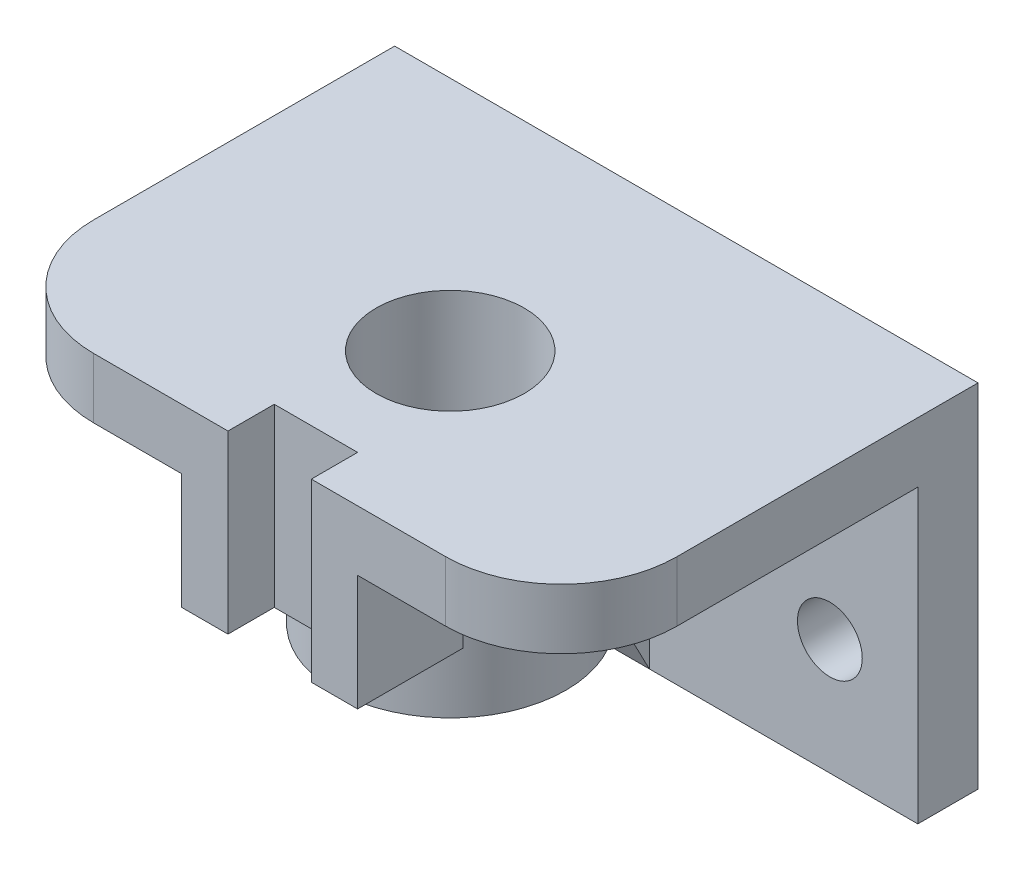
ISO-10303-21;
HEADER;
FILE_DESCRIPTION(('STEP AP214'),'2;1');
FILE_NAME('part.step','',(''),(''),'','','');
FILE_SCHEMA(('AUTOMOTIVE_DESIGN { 1 0 10303 214 1 1 1 1 }'));
ENDSEC;
DATA;
#1=APPLICATION_CONTEXT('core data for automotive mechanical design processes');
#2=APPLICATION_PROTOCOL_DEFINITION('international standard','automotive_design',2000,#1);
#3=PRODUCT_CONTEXT('',#1,'mechanical');
#4=PRODUCT('Part','Part','',(#3));
#5=PRODUCT_RELATED_PRODUCT_CATEGORY('part','',(#4));
#6=PRODUCT_DEFINITION_FORMATION('','',#4);
#7=PRODUCT_DEFINITION_CONTEXT('part definition',#1,'design');
#8=PRODUCT_DEFINITION('design','',#6,#7);
#9=PRODUCT_DEFINITION_SHAPE('','',#8);
#10=(LENGTH_UNIT() NAMED_UNIT(*) SI_UNIT(.MILLI.,.METRE.));
#11=(NAMED_UNIT(*) PLANE_ANGLE_UNIT() SI_UNIT($,.RADIAN.));
#12=(NAMED_UNIT(*) SI_UNIT($,.STERADIAN.) SOLID_ANGLE_UNIT());
#13=UNCERTAINTY_MEASURE_WITH_UNIT(LENGTH_MEASURE(1.E-05),#10,'distance_accuracy_value','');
#14=(GEOMETRIC_REPRESENTATION_CONTEXT(3) GLOBAL_UNCERTAINTY_ASSIGNED_CONTEXT((#13)) GLOBAL_UNIT_ASSIGNED_CONTEXT((#10,
#11,#12)) REPRESENTATION_CONTEXT('',''));
#15=CARTESIAN_POINT('',(0.,0.,0.));
#16=DIRECTION('',(0.,0.,1.));
#17=DIRECTION('',(1.,0.,0.));
#18=AXIS2_PLACEMENT_3D('',#15,#16,#17);
#19=CARTESIAN_POINT('',(0.,63.,90.));
#20=DIRECTION('',(0.,1.,0.));
#21=DIRECTION('',(0.,0.,1.));
#22=AXIS2_PLACEMENT_3D('',#19,#20,#21);
#23=PLANE('',#22);
#24=DIRECTION('',(1.,0.,0.));
#25=VECTOR('',#24,1.);
#26=CARTESIAN_POINT('',(0.,63.,13.));
#27=LINE('',#26,#25);
#28=CARTESIAN_POINT('',(0.,63.,13.));
#29=VERTEX_POINT('',#28);
#30=CARTESIAN_POINT('',(58.,63.,13.));
#31=VERTEX_POINT('',#30);
#32=EDGE_CURVE('E366',#29,#31,#27,.T.);
#33=ORIENTED_EDGE('',*,*,#32,.T.);
#34=DIRECTION('',(0.,0.,1.));
#35=VECTOR('',#34,1.);
#36=CARTESIAN_POINT('',(58.,63.,90.));
#37=LINE('',#36,#35);
#38=CARTESIAN_POINT('',(58.,63.,26.5051025721682));
#39=VERTEX_POINT('',#38);
#40=EDGE_CURVE('E313',#31,#39,#37,.T.);
#41=ORIENTED_EDGE('',*,*,#40,.T.);
#42=CARTESIAN_POINT('',(63.,63.,51.));
#43=DIRECTION('',(0.,1.,0.));
#44=DIRECTION('',(0.,0.,1.));
#45=AXIS2_PLACEMENT_3D('',#42,#43,#44);
#46=CIRCLE('',#45,25.);
#47=CARTESIAN_POINT('',(44.,63.,67.2480768092719));
#48=VERTEX_POINT('',#47);
#49=EDGE_CURVE('E359',#48,#39,#46,.F.);
#50=ORIENTED_EDGE('',*,*,#49,.F.);
#51=DIRECTION('',(0.,0.,1.));
#52=VECTOR('',#51,1.);
#53=CARTESIAN_POINT('',(44.,63.,-0.001000000000001));
#54=LINE('',#53,#52);
#55=CARTESIAN_POINT('',(44.,63.,90.));
#56=VERTEX_POINT('',#55);
#57=EDGE_CURVE('E340',#48,#56,#54,.T.);
#58=ORIENTED_EDGE('',*,*,#57,.T.);
#59=DIRECTION('',(1.,0.,0.));
#60=VECTOR('',#59,1.);
#61=CARTESIAN_POINT('',(0.,63.,90.));
#62=LINE('',#61,#60);
#63=CARTESIAN_POINT('',(25.,63.,90.));
#64=VERTEX_POINT('',#63);
#65=EDGE_CURVE('E370',#64,#56,#62,.T.);
#66=ORIENTED_EDGE('',*,*,#65,.F.);
#67=CARTESIAN_POINT('',(25.,63.,65.));
#68=DIRECTION('',(0.,1.,0.));
#69=DIRECTION('',(0.,0.,1.));
#70=AXIS2_PLACEMENT_3D('',#67,#68,#69);
#71=CIRCLE('',#70,25.);
#72=CARTESIAN_POINT('',(0.,63.,65.));
#73=VERTEX_POINT('',#72);
#74=EDGE_CURVE('E407',#64,#73,#71,.F.);
#75=ORIENTED_EDGE('',*,*,#74,.T.);
#76=DIRECTION('',(0.,0.,-1.));
#77=VECTOR('',#76,1.);
#78=CARTESIAN_POINT('',(0.,63.,90.));
#79=LINE('',#78,#77);
#80=EDGE_CURVE('E374',#73,#29,#79,.T.);
#81=ORIENTED_EDGE('',*,*,#80,.T.);
#82=EDGE_LOOP('',(#33,#41,#50,#58,#66,#75,#81));
#83=FACE_BOUND('',#82,.T.);
#84=ADVANCED_FACE('F41',(#83),#23,.F.);
#85=CARTESIAN_POINT('',(0.,0.,13.));
#86=DIRECTION('',(0.,0.,-1.));
#87=DIRECTION('',(-1.,0.,0.));
#88=AXIS2_PLACEMENT_3D('',#85,#86,#87);
#89=PLANE('',#88);
#90=CARTESIAN_POINT('',(19.,25.,13.));
#91=DIRECTION('',(0.,0.,1.));
#92=DIRECTION('',(1.,0.,0.));
#93=AXIS2_PLACEMENT_3D('',#90,#91,#92);
#94=CIRCLE('',#93,7.);
#95=CARTESIAN_POINT('',(26.,25.,13.));
#96=VERTEX_POINT('',#95);
#97=EDGE_CURVE('E742',#96,#96,#94,.T.);
#98=ORIENTED_EDGE('',*,*,#97,.F.);
#99=EDGE_LOOP('',(#98));
#100=FACE_BOUND('',#99,.T.);
#101=DIRECTION('',(0.,-1.,0.));
#102=VECTOR('',#101,1.);
#103=CARTESIAN_POINT('',(58.,0.,13.));
#104=LINE('',#103,#102);
#105=CARTESIAN_POINT('',(58.,0.,13.));
#106=VERTEX_POINT('',#105);
#107=EDGE_CURVE('E195',#31,#106,#104,.T.);
#108=ORIENTED_EDGE('',*,*,#107,.F.);
#109=ORIENTED_EDGE('',*,*,#32,.F.);
#110=DIRECTION('',(0.,1.,0.));
#111=VECTOR('',#110,1.);
#112=CARTESIAN_POINT('',(0.,0.,13.));
#113=LINE('',#112,#111);
#114=CARTESIAN_POINT('',(0.,0.,13.));
#115=VERTEX_POINT('',#114);
#116=EDGE_CURVE('E381',#115,#29,#113,.T.);
#117=ORIENTED_EDGE('',*,*,#116,.F.);
#118=DIRECTION('',(1.,0.,0.));
#119=VECTOR('',#118,1.);
#120=CARTESIAN_POINT('',(0.,0.,13.));
#121=LINE('',#120,#119);
#122=EDGE_CURVE('E385',#115,#106,#121,.T.);
#123=ORIENTED_EDGE('',*,*,#122,.T.);
#124=EDGE_LOOP('',(#108,#109,#117,#123));
#125=FACE_BOUND('',#124,.T.);
#126=ADVANCED_FACE('F487',(#100,#125),#89,.F.);
#127=CARTESIAN_POINT('',(0.,0.,13.));
#128=DIRECTION('',(-1.,0.,0.));
#129=DIRECTION('',(0.,0.,1.));
#130=AXIS2_PLACEMENT_3D('',#127,#128,#129);
#131=PLANE('',#130);
#132=ORIENTED_EDGE('',*,*,#80,.F.);
#133=DIRECTION('',(0.,-1.,0.));
#134=VECTOR('',#133,1.);
#135=CARTESIAN_POINT('',(0.,0.,65.));
#136=LINE('',#135,#134);
#137=CARTESIAN_POINT('',(0.,76.,65.));
#138=VERTEX_POINT('',#137);
#139=EDGE_CURVE('E410',#73,#138,#136,.F.);
#140=ORIENTED_EDGE('',*,*,#139,.T.);
#141=DIRECTION('',(0.,0.,-1.));
#142=VECTOR('',#141,1.);
#143=CARTESIAN_POINT('',(0.,76.,13.));
#144=LINE('',#143,#142);
#145=CARTESIAN_POINT('',(0.,76.,0.));
#146=VERTEX_POINT('',#145);
#147=EDGE_CURVE('E389',#138,#146,#144,.T.);
#148=ORIENTED_EDGE('',*,*,#147,.T.);
#149=DIRECTION('',(0.,1.,0.));
#150=VECTOR('',#149,1.);
#151=CARTESIAN_POINT('',(0.,0.,0.));
#152=LINE('',#151,#150);
#153=CARTESIAN_POINT('',(0.,0.,0.));
#154=VERTEX_POINT('',#153);
#155=EDGE_CURVE('E380',#154,#146,#152,.T.);
#156=ORIENTED_EDGE('',*,*,#155,.F.);
#157=DIRECTION('',(0.,0.,-1.));
#158=VECTOR('',#157,1.);
#159=CARTESIAN_POINT('',(0.,0.,13.));
#160=LINE('',#159,#158);
#161=EDGE_CURVE('E398',#115,#154,#160,.T.);
#162=ORIENTED_EDGE('',*,*,#161,.F.);
#163=ORIENTED_EDGE('',*,*,#116,.T.);
#164=EDGE_LOOP('',(#132,#140,#148,#156,#162,#163));
#165=FACE_BOUND('',#164,.T.);
#166=ADVANCED_FACE('F475',(#165),#131,.T.);
#167=CARTESIAN_POINT('',(0.,0.,13.));
#168=DIRECTION('',(0.,1.,0.));
#169=DIRECTION('',(0.,0.,1.));
#170=AXIS2_PLACEMENT_3D('',#167,#168,#169);
#171=PLANE('',#170);
#172=DIRECTION('',(1.,0.,0.));
#173=VECTOR('',#172,1.);
#174=CARTESIAN_POINT('',(0.,0.,13.));
#175=LINE('',#174,#173);
#176=CARTESIAN_POINT('',(68.,0.,13.));
#177=VERTEX_POINT('',#176);
#178=EDGE_CURVE('E182',#106,#177,#175,.T.);
#179=ORIENTED_EDGE('',*,*,#178,.F.);
#180=ORIENTED_EDGE('',*,*,#122,.F.);
#181=ORIENTED_EDGE('',*,*,#161,.T.);
#182=DIRECTION('',(1.,0.,0.));
#183=VECTOR('',#182,1.);
#184=CARTESIAN_POINT('',(0.,0.,0.));
#185=LINE('',#184,#183);
#186=CARTESIAN_POINT('',(126.,0.,0.));
#187=VERTEX_POINT('',#186);
#188=EDGE_CURVE('E386',#154,#187,#185,.T.);
#189=ORIENTED_EDGE('',*,*,#188,.T.);
#190=DIRECTION('',(0.,0.,-1.));
#191=VECTOR('',#190,1.);
#192=CARTESIAN_POINT('',(126.,0.,13.));
#193=LINE('',#192,#191);
#194=CARTESIAN_POINT('',(126.,0.,13.));
#195=VERTEX_POINT('',#194);
#196=EDGE_CURVE('E213',#195,#187,#193,.T.);
#197=ORIENTED_EDGE('',*,*,#196,.F.);
#198=DIRECTION('',(-1.,0.,0.));
#199=VECTOR('',#198,1.);
#200=CARTESIAN_POINT('',(126.,0.,13.));
#201=LINE('',#200,#199);
#202=EDGE_CURVE('E210',#195,#177,#201,.T.);
#203=ORIENTED_EDGE('',*,*,#202,.T.);
#204=EDGE_LOOP('',(#179,#180,#181,#189,#197,#203));
#205=FACE_BOUND('',#204,.T.);
#206=ADVANCED_FACE('F211',(#205),#171,.F.);
#207=CARTESIAN_POINT('',(0.,76.,13.));
#208=DIRECTION('',(0.,1.,0.));
#209=DIRECTION('',(0.,0.,1.));
#210=AXIS2_PLACEMENT_3D('',#207,#208,#209);
#211=PLANE('',#210);
#212=CARTESIAN_POINT('',(63.,76.,51.));
#213=DIRECTION('',(0.,1.,0.));
#214=DIRECTION('',(0.,0.,1.));
#215=AXIS2_PLACEMENT_3D('',#212,#213,#214);
#216=CIRCLE('',#215,16.);
#217=CARTESIAN_POINT('',(63.,76.,67.));
#218=VERTEX_POINT('',#217);
#219=EDGE_CURVE('E746',#218,#218,#216,.T.);
#220=ORIENTED_EDGE('',*,*,#219,.F.);
#221=EDGE_LOOP('',(#220));
#222=FACE_BOUND('',#221,.T.);
#223=DIRECTION('',(-1.,0.,0.));
#224=VECTOR('',#223,1.);
#225=CARTESIAN_POINT('',(0.,76.,80.));
#226=LINE('',#225,#224);
#227=CARTESIAN_POINT('',(72.,76.,80.));
#228=VERTEX_POINT('',#227);
#229=CARTESIAN_POINT('',(54.,76.,80.));
#230=VERTEX_POINT('',#229);
#231=EDGE_CURVE('E11',#228,#230,#226,.T.);
#232=ORIENTED_EDGE('',*,*,#231,.F.);
#233=DIRECTION('',(0.,0.,1.));
#234=VECTOR('',#233,1.);
#235=CARTESIAN_POINT('',(72.,76.,13.));
#236=LINE('',#235,#234);
#237=CARTESIAN_POINT('',(72.,76.,90.));
#238=VERTEX_POINT('',#237);
#239=EDGE_CURVE('E257',#228,#238,#236,.T.);
#240=ORIENTED_EDGE('',*,*,#239,.T.);
#241=DIRECTION('',(1.,0.,0.));
#242=VECTOR('',#241,1.);
#243=CARTESIAN_POINT('',(63.,76.,90.));
#244=LINE('',#243,#242);
#245=CARTESIAN_POINT('',(101.,76.,90.));
#246=VERTEX_POINT('',#245);
#247=EDGE_CURVE('E265',#238,#246,#244,.T.);
#248=ORIENTED_EDGE('',*,*,#247,.T.);
#249=CARTESIAN_POINT('',(101.,76.,65.));
#250=DIRECTION('',(0.,-1.,0.));
#251=DIRECTION('',(0.,0.,1.));
#252=AXIS2_PLACEMENT_3D('',#249,#250,#251);
#253=CIRCLE('',#252,25.);
#254=CARTESIAN_POINT('',(126.,76.,65.));
#255=VERTEX_POINT('',#254);
#256=EDGE_CURVE('E301',#255,#246,#253,.T.);
#257=ORIENTED_EDGE('',*,*,#256,.F.);
#258=DIRECTION('',(0.,0.,-1.));
#259=VECTOR('',#258,1.);
#260=CARTESIAN_POINT('',(126.,76.,13.));
#261=LINE('',#260,#259);
#262=CARTESIAN_POINT('',(126.,76.,0.));
#263=VERTEX_POINT('',#262);
#264=EDGE_CURVE('E217',#255,#263,#261,.T.);
#265=ORIENTED_EDGE('',*,*,#264,.T.);
#266=DIRECTION('',(1.,0.,0.));
#267=VECTOR('',#266,1.);
#268=CARTESIAN_POINT('',(0.,76.,0.));
#269=LINE('',#268,#267);
#270=EDGE_CURVE('E393',#146,#263,#269,.T.);
#271=ORIENTED_EDGE('',*,*,#270,.F.);
#272=ORIENTED_EDGE('',*,*,#147,.F.);
#273=CARTESIAN_POINT('',(25.,76.,65.));
#274=DIRECTION('',(0.,1.,0.));
#275=DIRECTION('',(0.,0.,1.));
#276=AXIS2_PLACEMENT_3D('',#273,#274,#275);
#277=CIRCLE('',#276,25.);
#278=CARTESIAN_POINT('',(25.,76.,90.));
#279=VERTEX_POINT('',#278);
#280=EDGE_CURVE('E413',#138,#279,#277,.T.);
#281=ORIENTED_EDGE('',*,*,#280,.T.);
#282=DIRECTION('',(-1.,0.,0.));
#283=VECTOR('',#282,1.);
#284=CARTESIAN_POINT('',(63.,76.,90.));
#285=LINE('',#284,#283);
#286=CARTESIAN_POINT('',(54.,76.,90.));
#287=VERTEX_POINT('',#286);
#288=EDGE_CURVE('E367',#287,#279,#285,.T.);
#289=ORIENTED_EDGE('',*,*,#288,.F.);
#290=DIRECTION('',(0.,0.,1.));
#291=VECTOR('',#290,1.);
#292=CARTESIAN_POINT('',(54.,76.,13.));
#293=LINE('',#292,#291);
#294=EDGE_CURVE('E351',#230,#287,#293,.T.);
#295=ORIENTED_EDGE('',*,*,#294,.F.);
#296=EDGE_LOOP('',(#232,#240,#248,#257,#265,#271,#272,#281,#289,#295));
#297=FACE_BOUND('',#296,.T.);
#298=ADVANCED_FACE('F438',(#222,#297),#211,.T.);
#299=CARTESIAN_POINT('',(0.,0.,0.));
#300=DIRECTION('',(0.,0.,-1.));
#301=DIRECTION('',(-1.,0.,0.));
#302=AXIS2_PLACEMENT_3D('',#299,#300,#301);
#303=PLANE('',#302);
#304=CARTESIAN_POINT('',(107.,25.,0.));
#305=DIRECTION('',(0.,0.,1.));
#306=DIRECTION('',(1.,0.,0.));
#307=AXIS2_PLACEMENT_3D('',#304,#305,#306);
#308=CIRCLE('',#307,7.);
#309=CARTESIAN_POINT('',(114.,25.,0.));
#310=VERTEX_POINT('',#309);
#311=EDGE_CURVE('E753',#310,#310,#308,.T.);
#312=ORIENTED_EDGE('',*,*,#311,.T.);
#313=EDGE_LOOP('',(#312));
#314=FACE_BOUND('',#313,.T.);
#315=CARTESIAN_POINT('',(19.,25.,0.));
#316=DIRECTION('',(0.,0.,1.));
#317=DIRECTION('',(1.,0.,0.));
#318=AXIS2_PLACEMENT_3D('',#315,#316,#317);
#319=CIRCLE('',#318,7.);
#320=CARTESIAN_POINT('',(26.,25.,0.));
#321=VERTEX_POINT('',#320);
#322=EDGE_CURVE('E207',#321,#321,#319,.T.);
#323=ORIENTED_EDGE('',*,*,#322,.T.);
#324=EDGE_LOOP('',(#323));
#325=FACE_BOUND('',#324,.T.);
#326=ORIENTED_EDGE('',*,*,#270,.T.);
#327=DIRECTION('',(0.,1.,0.));
#328=VECTOR('',#327,1.);
#329=CARTESIAN_POINT('',(126.,0.,0.));
#330=LINE('',#329,#328);
#331=EDGE_CURVE('E279',#187,#263,#330,.T.);
#332=ORIENTED_EDGE('',*,*,#331,.F.);
#333=ORIENTED_EDGE('',*,*,#188,.F.);
#334=ORIENTED_EDGE('',*,*,#155,.T.);
#335=EDGE_LOOP('',(#326,#332,#333,#334));
#336=FACE_BOUND('',#335,.T.);
#337=ADVANCED_FACE('F472',(#314,#325,#336),#303,.T.);
#338=CARTESIAN_POINT('',(0.,0.,90.));
#339=DIRECTION('',(0.,0.,1.));
#340=DIRECTION('',(1.,0.,0.));
#341=AXIS2_PLACEMENT_3D('',#338,#339,#340);
#342=PLANE('',#341);
#343=DIRECTION('',(0.,-1.,0.));
#344=VECTOR('',#343,1.);
#345=CARTESIAN_POINT('',(54.,0.,90.));
#346=LINE('',#345,#344);
#347=CARTESIAN_POINT('',(54.,38.,90.));
#348=VERTEX_POINT('',#347);
#349=EDGE_CURVE('E50',#287,#348,#346,.T.);
#350=ORIENTED_EDGE('',*,*,#349,.F.);
#351=ORIENTED_EDGE('',*,*,#288,.T.);
#352=DIRECTION('',(0.,-1.,0.));
#353=VECTOR('',#352,1.);
#354=CARTESIAN_POINT('',(25.,0.,90.));
#355=LINE('',#354,#353);
#356=EDGE_CURVE('E401',#279,#64,#355,.T.);
#357=ORIENTED_EDGE('',*,*,#356,.T.);
#358=ORIENTED_EDGE('',*,*,#65,.T.);
#359=DIRECTION('',(0.,-1.,0.));
#360=VECTOR('',#359,1.);
#361=CARTESIAN_POINT('',(44.,63.,90.));
#362=LINE('',#361,#360);
#363=CARTESIAN_POINT('',(44.,38.,90.));
#364=VERTEX_POINT('',#363);
#365=EDGE_CURVE('E323',#56,#364,#362,.T.);
#366=ORIENTED_EDGE('',*,*,#365,.T.);
#367=DIRECTION('',(1.,0.,0.));
#368=VECTOR('',#367,1.);
#369=CARTESIAN_POINT('',(44.,38.,90.));
#370=LINE('',#369,#368);
#371=EDGE_CURVE('E336',#364,#348,#370,.T.);
#372=ORIENTED_EDGE('',*,*,#371,.T.);
#373=EDGE_LOOP('',(#350,#351,#357,#358,#366,#372));
#374=FACE_BOUND('',#373,.T.);
#375=ADVANCED_FACE('F426',(#374),#342,.T.);
#376=CARTESIAN_POINT('',(25.,0.,65.));
#377=DIRECTION('',(0.,-1.,0.));
#378=DIRECTION('',(0.,0.,-1.));
#379=AXIS2_PLACEMENT_3D('',#376,#377,#378);
#380=CYLINDRICAL_SURFACE('',#379,25.);
#381=ORIENTED_EDGE('',*,*,#280,.F.);
#382=ORIENTED_EDGE('',*,*,#139,.F.);
#383=ORIENTED_EDGE('',*,*,#74,.F.);
#384=ORIENTED_EDGE('',*,*,#356,.F.);
#385=EDGE_LOOP('',(#381,#382,#383,#384));
#386=FACE_BOUND('',#385,.T.);
#387=ADVANCED_FACE('F43',(#386),#380,.T.);
#388=CARTESIAN_POINT('',(63.,25.,51.));
#389=DIRECTION('',(0.,-1.,0.));
#390=DIRECTION('',(0.,0.,-1.));
#391=AXIS2_PLACEMENT_3D('',#388,#389,#390);
#392=PLANE('',#391);
#393=CARTESIAN_POINT('',(63.,25.,51.));
#394=DIRECTION('',(0.,1.,0.));
#395=DIRECTION('',(0.,0.,-1.));
#396=AXIS2_PLACEMENT_3D('',#393,#394,#395);
#397=CIRCLE('',#396,16.);
#398=CARTESIAN_POINT('',(63.,25.,35.));
#399=VERTEX_POINT('',#398);
#400=EDGE_CURVE('E354',#399,#399,#397,.T.);
#401=ORIENTED_EDGE('',*,*,#400,.T.);
#402=EDGE_LOOP('',(#401));
#403=FACE_BOUND('',#402,.T.);
#404=CARTESIAN_POINT('',(63.,25.,51.));
#405=DIRECTION('',(0.,-1.,0.));
#406=DIRECTION('',(0.,0.,-1.));
#407=AXIS2_PLACEMENT_3D('',#404,#405,#406);
#408=CIRCLE('',#407,25.);
#409=CARTESIAN_POINT('',(63.,25.,26.));
#410=VERTEX_POINT('',#409);
#411=EDGE_CURVE('E355',#410,#410,#408,.T.);
#412=ORIENTED_EDGE('',*,*,#411,.T.);
#413=EDGE_LOOP('',(#412));
#414=FACE_BOUND('',#413,.T.);
#415=ADVANCED_FACE('F478',(#403,#414),#392,.T.);
#416=CARTESIAN_POINT('',(63.,118.901699437495,51.));
#417=DIRECTION('',(0.,-1.,0.));
#418=DIRECTION('',(0.,0.,-1.));
#419=AXIS2_PLACEMENT_3D('',#416,#417,#418);
#420=CYLINDRICAL_SURFACE('',#419,25.);
#421=CARTESIAN_POINT('',(63.,73.0769230769231,51.));
#422=DIRECTION('',(0.,-0.461352736641989,0.887216801234595));
#423=DIRECTION('',(0.,-0.887216801234595,-0.461352736641989));
#424=AXIS2_PLACEMENT_3D('',#421,#422,#423);
#425=ELLIPSE('',#424,54.1884723215591,25.);
#426=CARTESIAN_POINT('',(58.,25.9713511003235,26.5051025721682));
#427=VERTEX_POINT('',#426);
#428=EDGE_CURVE('E196',#410,#427,#425,.F.);
#429=ORIENTED_EDGE('',*,*,#428,.F.);
#430=ORIENTED_EDGE('',*,*,#411,.F.);
#431=CARTESIAN_POINT('',(63.,73.0769230769231,51.));
#432=DIRECTION('',(0.,0.461352736641989,-0.887216801234595));
#433=DIRECTION('',(0.,-0.887216801234595,-0.461352736641989));
#434=AXIS2_PLACEMENT_3D('',#431,#432,#433);
#435=ELLIPSE('',#434,54.1884723215591,25.);
#436=CARTESIAN_POINT('',(68.,25.9713511003235,26.5051025721682));
#437=VERTEX_POINT('',#436);
#438=EDGE_CURVE('E226',#410,#437,#435,.F.);
#439=ORIENTED_EDGE('',*,*,#438,.T.);
#440=DIRECTION('',(0.,-1.,0.));
#441=VECTOR('',#440,1.);
#442=CARTESIAN_POINT('',(68.,118.901699437495,26.5051025721682));
#443=LINE('',#442,#441);
#444=CARTESIAN_POINT('',(68.,63.,26.5051025721682));
#445=VERTEX_POINT('',#444);
#446=EDGE_CURVE('E204',#437,#445,#443,.F.);
#447=ORIENTED_EDGE('',*,*,#446,.T.);
#448=CARTESIAN_POINT('',(63.,63.,51.));
#449=DIRECTION('',(0.,-1.,0.));
#450=DIRECTION('',(0.,0.,1.));
#451=AXIS2_PLACEMENT_3D('',#448,#449,#450);
#452=CIRCLE('',#451,25.);
#453=CARTESIAN_POINT('',(82.,63.,67.2480768092719));
#454=VERTEX_POINT('',#453);
#455=EDGE_CURVE('E261',#454,#445,#452,.F.);
#456=ORIENTED_EDGE('',*,*,#455,.F.);
#457=DIRECTION('',(0.,-1.,0.));
#458=VECTOR('',#457,1.);
#459=CARTESIAN_POINT('',(82.,118.901699437495,67.248076809272));
#460=LINE('',#459,#458);
#461=CARTESIAN_POINT('',(82.,38.,67.248076809272));
#462=VERTEX_POINT('',#461);
#463=EDGE_CURVE('E237',#462,#454,#460,.F.);
#464=ORIENTED_EDGE('',*,*,#463,.F.);
#465=CARTESIAN_POINT('',(63.,38.,51.));
#466=DIRECTION('',(0.,-1.,0.));
#467=DIRECTION('',(0.,0.,-1.));
#468=AXIS2_PLACEMENT_3D('',#465,#466,#467);
#469=CIRCLE('',#468,25.);
#470=CARTESIAN_POINT('',(44.,38.,67.248076809272));
#471=VERTEX_POINT('',#470);
#472=EDGE_CURVE('E328',#462,#471,#469,.T.);
#473=ORIENTED_EDGE('',*,*,#472,.T.);
#474=DIRECTION('',(0.,-1.,0.));
#475=VECTOR('',#474,1.);
#476=CARTESIAN_POINT('',(44.,118.901699437495,67.248076809272));
#477=LINE('',#476,#475);
#478=EDGE_CURVE('E324',#471,#48,#477,.F.);
#479=ORIENTED_EDGE('',*,*,#478,.T.);
#480=ORIENTED_EDGE('',*,*,#49,.T.);
#481=DIRECTION('',(0.,-1.,0.));
#482=VECTOR('',#481,1.);
#483=CARTESIAN_POINT('',(58.,118.901699437495,26.5051025721682));
#484=LINE('',#483,#482);
#485=EDGE_CURVE('E57',#427,#39,#484,.F.);
#486=ORIENTED_EDGE('',*,*,#485,.F.);
#487=EDGE_LOOP('',(#429,#430,#439,#447,#456,#464,#473,#479,#480,#486));
#488=FACE_BOUND('',#487,.T.);
#489=ADVANCED_FACE('F451',(#488),#420,.T.);
#490=CARTESIAN_POINT('',(63.,118.901699437495,51.));
#491=DIRECTION('',(0.,-1.,0.));
#492=DIRECTION('',(0.,0.,-1.));
#493=AXIS2_PLACEMENT_3D('',#490,#491,#492);
#494=CYLINDRICAL_SURFACE('',#493,16.);
#495=ORIENTED_EDGE('',*,*,#400,.F.);
#496=EDGE_LOOP('',(#495));
#497=FACE_BOUND('',#496,.T.);
#498=ORIENTED_EDGE('',*,*,#219,.T.);
#499=EDGE_LOOP('',(#498));
#500=FACE_BOUND('',#499,.T.);
#501=ADVANCED_FACE('F553',(#497,#500),#494,.F.);
#502=CARTESIAN_POINT('',(54.,140.,80.));
#503=DIRECTION('',(0.,0.,-1.));
#504=DIRECTION('',(-1.,0.,0.));
#505=AXIS2_PLACEMENT_3D('',#502,#503,#504);
#506=PLANE('',#505);
#507=ORIENTED_EDGE('',*,*,#231,.T.);
#508=DIRECTION('',(0.,-1.,0.));
#509=VECTOR('',#508,1.);
#510=CARTESIAN_POINT('',(54.,140.,80.));
#511=LINE('',#510,#509);
#512=CARTESIAN_POINT('',(54.,38.,80.));
#513=VERTEX_POINT('',#512);
#514=EDGE_CURVE('E64',#230,#513,#511,.T.);
#515=ORIENTED_EDGE('',*,*,#514,.T.);
#516=DIRECTION('',(1.,0.,0.));
#517=VECTOR('',#516,1.);
#518=CARTESIAN_POINT('',(54.,38.,80.));
#519=LINE('',#518,#517);
#520=CARTESIAN_POINT('',(72.,38.,80.));
#521=VERTEX_POINT('',#520);
#522=EDGE_CURVE('E320',#513,#521,#519,.T.);
#523=ORIENTED_EDGE('',*,*,#522,.T.);
#524=DIRECTION('',(0.,-1.,0.));
#525=VECTOR('',#524,1.);
#526=CARTESIAN_POINT('',(72.,140.,80.));
#527=LINE('',#526,#525);
#528=EDGE_CURVE('E239',#228,#521,#527,.T.);
#529=ORIENTED_EDGE('',*,*,#528,.F.);
#530=EDGE_LOOP('',(#507,#515,#523,#529));
#531=FACE_BOUND('',#530,.T.);
#532=ADVANCED_FACE('F432',(#531),#506,.F.);
#533=CARTESIAN_POINT('',(54.,140.,90.));
#534=DIRECTION('',(-1.,0.,0.));
#535=DIRECTION('',(0.,0.,1.));
#536=AXIS2_PLACEMENT_3D('',#533,#534,#535);
#537=PLANE('',#536);
#538=DIRECTION('',(0.,0.,1.));
#539=VECTOR('',#538,1.);
#540=CARTESIAN_POINT('',(54.,38.,-0.001000000000001));
#541=LINE('',#540,#539);
#542=EDGE_CURVE('E329',#513,#348,#541,.T.);
#543=ORIENTED_EDGE('',*,*,#542,.F.);
#544=ORIENTED_EDGE('',*,*,#514,.F.);
#545=ORIENTED_EDGE('',*,*,#294,.T.);
#546=ORIENTED_EDGE('',*,*,#349,.T.);
#547=EDGE_LOOP('',(#543,#544,#545,#546));
#548=FACE_BOUND('',#547,.T.);
#549=ADVANCED_FACE('F421',(#548),#537,.F.);
#550=CARTESIAN_POINT('',(44.,63.,-0.001000000000001));
#551=DIRECTION('',(-1.,0.,0.));
#552=DIRECTION('',(0.,0.,1.));
#553=AXIS2_PLACEMENT_3D('',#550,#551,#552);
#554=PLANE('',#553);
#555=ORIENTED_EDGE('',*,*,#478,.F.);
#556=DIRECTION('',(0.,0.,1.));
#557=VECTOR('',#556,1.);
#558=CARTESIAN_POINT('',(44.,38.,-0.001000000000001));
#559=LINE('',#558,#557);
#560=EDGE_CURVE('E343',#471,#364,#559,.T.);
#561=ORIENTED_EDGE('',*,*,#560,.T.);
#562=ORIENTED_EDGE('',*,*,#365,.F.);
#563=ORIENTED_EDGE('',*,*,#57,.F.);
#564=EDGE_LOOP('',(#555,#561,#562,#563));
#565=FACE_BOUND('',#564,.T.);
#566=ADVANCED_FACE('F448',(#565),#554,.T.);
#567=CARTESIAN_POINT('',(44.,38.,-0.001000000000001));
#568=DIRECTION('',(0.,-1.,0.));
#569=DIRECTION('',(0.,0.,-1.));
#570=AXIS2_PLACEMENT_3D('',#567,#568,#569);
#571=PLANE('',#570);
#572=ORIENTED_EDGE('',*,*,#472,.F.);
#573=DIRECTION('',(0.,0.,1.));
#574=VECTOR('',#573,1.);
#575=CARTESIAN_POINT('',(82.,38.,-0.001000000000001));
#576=LINE('',#575,#574);
#577=CARTESIAN_POINT('',(82.,38.,90.));
#578=VERTEX_POINT('',#577);
#579=EDGE_CURVE('E248',#462,#578,#576,.T.);
#580=ORIENTED_EDGE('',*,*,#579,.T.);
#581=DIRECTION('',(-1.,0.,0.));
#582=VECTOR('',#581,1.);
#583=CARTESIAN_POINT('',(82.,38.,90.));
#584=LINE('',#583,#582);
#585=CARTESIAN_POINT('',(72.,38.,90.));
#586=VERTEX_POINT('',#585);
#587=EDGE_CURVE('E231',#578,#586,#584,.T.);
#588=ORIENTED_EDGE('',*,*,#587,.T.);
#589=DIRECTION('',(0.,0.,1.));
#590=VECTOR('',#589,1.);
#591=CARTESIAN_POINT('',(72.,38.,-0.001000000000001));
#592=LINE('',#591,#590);
#593=EDGE_CURVE('E240',#521,#586,#592,.T.);
#594=ORIENTED_EDGE('',*,*,#593,.F.);
#595=ORIENTED_EDGE('',*,*,#522,.F.);
#596=ORIENTED_EDGE('',*,*,#542,.T.);
#597=ORIENTED_EDGE('',*,*,#371,.F.);
#598=ORIENTED_EDGE('',*,*,#560,.F.);
#599=EDGE_LOOP('',(#572,#580,#588,#594,#595,#596,#597,#598));
#600=FACE_BOUND('',#599,.T.);
#601=ADVANCED_FACE('F429',(#600),#571,.T.);
#602=CARTESIAN_POINT('',(58.,25.,26.));
#603=DIRECTION('',(1.,0.,0.));
#604=DIRECTION('',(0.,1.,0.));
#605=AXIS2_PLACEMENT_3D('',#602,#603,#604);
#606=PLANE('',#605);
#607=DIRECTION('',(0.,-0.887216801234595,-0.461352736641989));
#608=VECTOR('',#607,1.);
#609=CARTESIAN_POINT('',(58.,25.,26.));
#610=LINE('',#609,#608);
#611=EDGE_CURVE('E189',#427,#106,#610,.T.);
#612=ORIENTED_EDGE('',*,*,#611,.F.);
#613=ORIENTED_EDGE('',*,*,#485,.T.);
#614=ORIENTED_EDGE('',*,*,#40,.F.);
#615=ORIENTED_EDGE('',*,*,#107,.T.);
#616=EDGE_LOOP('',(#612,#613,#614,#615));
#617=FACE_BOUND('',#616,.T.);
#618=ADVANCED_FACE('F601',(#617),#606,.F.);
#619=CARTESIAN_POINT('',(63.,0.,13.));
#620=DIRECTION('',(0.,-0.461352736641989,0.887216801234595));
#621=DIRECTION('',(0.,-0.887216801234595,-0.461352736641989));
#622=AXIS2_PLACEMENT_3D('',#619,#620,#621);
#623=PLANE('',#622);
#624=ORIENTED_EDGE('',*,*,#611,.T.);
#625=ORIENTED_EDGE('',*,*,#178,.T.);
#626=DIRECTION('',(0.,-0.887216801234595,-0.461352736641989));
#627=VECTOR('',#626,1.);
#628=CARTESIAN_POINT('',(68.,25.,26.));
#629=LINE('',#628,#627);
#630=EDGE_CURVE('E186',#437,#177,#629,.T.);
#631=ORIENTED_EDGE('',*,*,#630,.F.);
#632=ORIENTED_EDGE('',*,*,#438,.F.);
#633=ORIENTED_EDGE('',*,*,#428,.T.);
#634=EDGE_LOOP('',(#624,#625,#631,#632,#633));
#635=FACE_BOUND('',#634,.T.);
#636=ADVANCED_FACE('F184',(#635),#623,.T.);
#637=CARTESIAN_POINT('',(126.,63.,90.));
#638=DIRECTION('',(0.,1.,0.));
#639=DIRECTION('',(0.,0.,1.));
#640=AXIS2_PLACEMENT_3D('',#637,#638,#639);
#641=PLANE('',#640);
#642=DIRECTION('',(-1.,0.,0.));
#643=VECTOR('',#642,1.);
#644=CARTESIAN_POINT('',(126.,63.,13.));
#645=LINE('',#644,#643);
#646=CARTESIAN_POINT('',(126.,63.,13.));
#647=VERTEX_POINT('',#646);
#648=CARTESIAN_POINT('',(68.,63.,13.));
#649=VERTEX_POINT('',#648);
#650=EDGE_CURVE('E223',#647,#649,#645,.T.);
#651=ORIENTED_EDGE('',*,*,#650,.F.);
#652=DIRECTION('',(0.,0.,-1.));
#653=VECTOR('',#652,1.);
#654=CARTESIAN_POINT('',(126.,63.,90.));
#655=LINE('',#654,#653);
#656=CARTESIAN_POINT('',(126.,63.,65.));
#657=VERTEX_POINT('',#656);
#658=EDGE_CURVE('E273',#657,#647,#655,.T.);
#659=ORIENTED_EDGE('',*,*,#658,.F.);
#660=CARTESIAN_POINT('',(101.,63.,65.));
#661=DIRECTION('',(0.,-1.,0.));
#662=DIRECTION('',(0.,0.,1.));
#663=AXIS2_PLACEMENT_3D('',#660,#661,#662);
#664=CIRCLE('',#663,25.);
#665=CARTESIAN_POINT('',(101.,63.,90.));
#666=VERTEX_POINT('',#665);
#667=EDGE_CURVE('E293',#666,#657,#664,.F.);
#668=ORIENTED_EDGE('',*,*,#667,.F.);
#669=DIRECTION('',(-1.,0.,0.));
#670=VECTOR('',#669,1.);
#671=CARTESIAN_POINT('',(126.,63.,90.));
#672=LINE('',#671,#670);
#673=CARTESIAN_POINT('',(82.,63.,90.));
#674=VERTEX_POINT('',#673);
#675=EDGE_CURVE('E269',#666,#674,#672,.T.);
#676=ORIENTED_EDGE('',*,*,#675,.T.);
#677=DIRECTION('',(0.,0.,1.));
#678=VECTOR('',#677,1.);
#679=CARTESIAN_POINT('',(82.,63.,-0.001000000000001));
#680=LINE('',#679,#678);
#681=EDGE_CURVE('E245',#454,#674,#680,.T.);
#682=ORIENTED_EDGE('',*,*,#681,.F.);
#683=ORIENTED_EDGE('',*,*,#455,.T.);
#684=DIRECTION('',(0.,0.,1.));
#685=VECTOR('',#684,1.);
#686=CARTESIAN_POINT('',(68.,63.,90.));
#687=LINE('',#686,#685);
#688=EDGE_CURVE('E233',#649,#445,#687,.T.);
#689=ORIENTED_EDGE('',*,*,#688,.F.);
#690=EDGE_LOOP('',(#651,#659,#668,#676,#682,#683,#689));
#691=FACE_BOUND('',#690,.T.);
#692=ADVANCED_FACE('F624',(#691),#641,.F.);
#693=CARTESIAN_POINT('',(126.,0.,13.));
#694=DIRECTION('',(0.,0.,-1.));
#695=DIRECTION('',(1.,0.,0.));
#696=AXIS2_PLACEMENT_3D('',#693,#694,#695);
#697=PLANE('',#696);
#698=CARTESIAN_POINT('',(107.,25.,13.));
#699=DIRECTION('',(0.,0.,1.));
#700=DIRECTION('',(1.,0.,0.));
#701=AXIS2_PLACEMENT_3D('',#698,#699,#700);
#702=CIRCLE('',#701,7.);
#703=CARTESIAN_POINT('',(114.,25.,13.));
#704=VERTEX_POINT('',#703);
#705=EDGE_CURVE('E754',#704,#704,#702,.T.);
#706=ORIENTED_EDGE('',*,*,#705,.F.);
#707=EDGE_LOOP('',(#706));
#708=FACE_BOUND('',#707,.T.);
#709=DIRECTION('',(0.,-1.,0.));
#710=VECTOR('',#709,1.);
#711=CARTESIAN_POINT('',(68.,0.,13.));
#712=LINE('',#711,#710);
#713=EDGE_CURVE('E202',#649,#177,#712,.T.);
#714=ORIENTED_EDGE('',*,*,#713,.T.);
#715=ORIENTED_EDGE('',*,*,#202,.F.);
#716=DIRECTION('',(0.,1.,0.));
#717=VECTOR('',#716,1.);
#718=CARTESIAN_POINT('',(126.,0.,13.));
#719=LINE('',#718,#717);
#720=EDGE_CURVE('E218',#195,#647,#719,.T.);
#721=ORIENTED_EDGE('',*,*,#720,.T.);
#722=ORIENTED_EDGE('',*,*,#650,.T.);
#723=EDGE_LOOP('',(#714,#715,#721,#722));
#724=FACE_BOUND('',#723,.T.);
#725=ADVANCED_FACE('F221',(#708,#724),#697,.F.);
#726=CARTESIAN_POINT('',(126.,0.,13.));
#727=DIRECTION('',(1.,0.,0.));
#728=DIRECTION('',(0.,0.,1.));
#729=AXIS2_PLACEMENT_3D('',#726,#727,#728);
#730=PLANE('',#729);
#731=ORIENTED_EDGE('',*,*,#658,.T.);
#732=ORIENTED_EDGE('',*,*,#720,.F.);
#733=ORIENTED_EDGE('',*,*,#196,.T.);
#734=ORIENTED_EDGE('',*,*,#331,.T.);
#735=ORIENTED_EDGE('',*,*,#264,.F.);
#736=DIRECTION('',(0.,-1.,0.));
#737=VECTOR('',#736,1.);
#738=CARTESIAN_POINT('',(126.,0.,65.));
#739=LINE('',#738,#737);
#740=EDGE_CURVE('E297',#657,#255,#739,.F.);
#741=ORIENTED_EDGE('',*,*,#740,.F.);
#742=EDGE_LOOP('',(#731,#732,#733,#734,#735,#741));
#743=FACE_BOUND('',#742,.T.);
#744=ADVANCED_FACE('F469',(#743),#730,.T.);
#745=CARTESIAN_POINT('',(126.,0.,90.));
#746=DIRECTION('',(0.,0.,1.));
#747=DIRECTION('',(-1.,0.,0.));
#748=AXIS2_PLACEMENT_3D('',#745,#746,#747);
#749=PLANE('',#748);
#750=DIRECTION('',(0.,-1.,0.));
#751=VECTOR('',#750,1.);
#752=CARTESIAN_POINT('',(72.,0.,90.));
#753=LINE('',#752,#751);
#754=EDGE_CURVE('E305',#238,#586,#753,.T.);
#755=ORIENTED_EDGE('',*,*,#754,.T.);
#756=ORIENTED_EDGE('',*,*,#587,.F.);
#757=DIRECTION('',(0.,-1.,0.));
#758=VECTOR('',#757,1.);
#759=CARTESIAN_POINT('',(82.,63.,90.));
#760=LINE('',#759,#758);
#761=EDGE_CURVE('E225',#674,#578,#760,.T.);
#762=ORIENTED_EDGE('',*,*,#761,.F.);
#763=ORIENTED_EDGE('',*,*,#675,.F.);
#764=DIRECTION('',(0.,-1.,0.));
#765=VECTOR('',#764,1.);
#766=CARTESIAN_POINT('',(101.,0.,90.));
#767=LINE('',#766,#765);
#768=EDGE_CURVE('E287',#246,#666,#767,.T.);
#769=ORIENTED_EDGE('',*,*,#768,.F.);
#770=ORIENTED_EDGE('',*,*,#247,.F.);
#771=EDGE_LOOP('',(#755,#756,#762,#763,#769,#770));
#772=FACE_BOUND('',#771,.T.);
#773=ADVANCED_FACE('F461',(#772),#749,.T.);
#774=CARTESIAN_POINT('',(101.,0.,65.));
#775=DIRECTION('',(0.,-1.,0.));
#776=DIRECTION('',(0.,0.,-1.));
#777=AXIS2_PLACEMENT_3D('',#774,#775,#776);
#778=CYLINDRICAL_SURFACE('',#777,25.);
#779=ORIENTED_EDGE('',*,*,#256,.T.);
#780=ORIENTED_EDGE('',*,*,#768,.T.);
#781=ORIENTED_EDGE('',*,*,#667,.T.);
#782=ORIENTED_EDGE('',*,*,#740,.T.);
#783=EDGE_LOOP('',(#779,#780,#781,#782));
#784=FACE_BOUND('',#783,.T.);
#785=ADVANCED_FACE('F464',(#784),#778,.T.);
#786=CARTESIAN_POINT('',(72.,140.,90.));
#787=DIRECTION('',(1.,0.,0.));
#788=DIRECTION('',(0.,0.,1.));
#789=AXIS2_PLACEMENT_3D('',#786,#787,#788);
#790=PLANE('',#789);
#791=ORIENTED_EDGE('',*,*,#593,.T.);
#792=ORIENTED_EDGE('',*,*,#754,.F.);
#793=ORIENTED_EDGE('',*,*,#239,.F.);
#794=ORIENTED_EDGE('',*,*,#528,.T.);
#795=EDGE_LOOP('',(#791,#792,#793,#794));
#796=FACE_BOUND('',#795,.T.);
#797=ADVANCED_FACE('F435',(#796),#790,.F.);
#798=CARTESIAN_POINT('',(82.,63.,-0.001000000000001));
#799=DIRECTION('',(1.,0.,0.));
#800=DIRECTION('',(0.,0.,1.));
#801=AXIS2_PLACEMENT_3D('',#798,#799,#800);
#802=PLANE('',#801);
#803=ORIENTED_EDGE('',*,*,#463,.T.);
#804=ORIENTED_EDGE('',*,*,#681,.T.);
#805=ORIENTED_EDGE('',*,*,#761,.T.);
#806=ORIENTED_EDGE('',*,*,#579,.F.);
#807=EDGE_LOOP('',(#803,#804,#805,#806));
#808=FACE_BOUND('',#807,.T.);
#809=ADVANCED_FACE('F456',(#808),#802,.T.);
#810=CARTESIAN_POINT('',(68.,25.,26.));
#811=DIRECTION('',(-1.,0.,0.));
#812=DIRECTION('',(0.,1.,0.));
#813=AXIS2_PLACEMENT_3D('',#810,#811,#812);
#814=PLANE('',#813);
#815=ORIENTED_EDGE('',*,*,#630,.T.);
#816=ORIENTED_EDGE('',*,*,#713,.F.);
#817=ORIENTED_EDGE('',*,*,#688,.T.);
#818=ORIENTED_EDGE('',*,*,#446,.F.);
#819=EDGE_LOOP('',(#815,#816,#817,#818));
#820=FACE_BOUND('',#819,.T.);
#821=ADVANCED_FACE('F199',(#820),#814,.F.);
#822=CARTESIAN_POINT('',(19.,25.,0.));
#823=DIRECTION('',(0.,0.,1.));
#824=DIRECTION('',(1.,0.,0.));
#825=AXIS2_PLACEMENT_3D('',#822,#823,#824);
#826=CYLINDRICAL_SURFACE('',#825,7.);
#827=CARTESIAN_POINT('',(26.,25.,0.));
#828=CARTESIAN_POINT('',(26.,25.,0.135416666666666));
#829=CARTESIAN_POINT('',(26.,25.,0.270833333333333));
#830=CARTESIAN_POINT('',(26.,25.,0.541666666666667));
#831=CARTESIAN_POINT('',(26.,25.,0.677083333333333));
#832=CARTESIAN_POINT('',(26.,25.,0.947916666666667));
#833=CARTESIAN_POINT('',(26.,25.,1.08333333333333));
#834=CARTESIAN_POINT('',(26.,25.,1.35416666666667));
#835=CARTESIAN_POINT('',(26.,25.,1.48958333333333));
#836=CARTESIAN_POINT('',(26.,25.,1.76041666666667));
#837=CARTESIAN_POINT('',(26.,25.,1.89583333333333));
#838=CARTESIAN_POINT('',(26.,25.,2.16666666666667));
#839=CARTESIAN_POINT('',(26.,25.,2.30208333333333));
#840=CARTESIAN_POINT('',(26.,25.,2.57291666666667));
#841=CARTESIAN_POINT('',(26.,25.,2.70833333333333));
#842=CARTESIAN_POINT('',(26.,25.,2.97916666666667));
#843=CARTESIAN_POINT('',(26.,25.,3.11458333333333));
#844=CARTESIAN_POINT('',(26.,25.,3.38541666666667));
#845=CARTESIAN_POINT('',(26.,25.,3.52083333333333));
#846=CARTESIAN_POINT('',(26.,25.,3.79166666666667));
#847=CARTESIAN_POINT('',(26.,25.,3.92708333333333));
#848=CARTESIAN_POINT('',(26.,25.,4.19791666666667));
#849=CARTESIAN_POINT('',(26.,25.,4.33333333333333));
#850=CARTESIAN_POINT('',(26.,25.,4.60416666666667));
#851=CARTESIAN_POINT('',(26.,25.,4.73958333333333));
#852=CARTESIAN_POINT('',(26.,25.,5.01041666666667));
#853=CARTESIAN_POINT('',(26.,25.,5.14583333333333));
#854=CARTESIAN_POINT('',(26.,25.,5.41666666666667));
#855=CARTESIAN_POINT('',(26.,25.,5.55208333333333));
#856=CARTESIAN_POINT('',(26.,25.,5.82291666666667));
#857=CARTESIAN_POINT('',(26.,25.,5.95833333333333));
#858=CARTESIAN_POINT('',(26.,25.,6.22916666666667));
#859=CARTESIAN_POINT('',(26.,25.,6.36458333333333));
#860=CARTESIAN_POINT('',(26.,25.,6.63541666666667));
#861=CARTESIAN_POINT('',(26.,25.,6.77083333333333));
#862=CARTESIAN_POINT('',(26.,25.,7.04166666666667));
#863=CARTESIAN_POINT('',(26.,25.,7.17708333333333));
#864=CARTESIAN_POINT('',(26.,25.,7.44791666666667));
#865=CARTESIAN_POINT('',(26.,25.,7.58333333333333));
#866=CARTESIAN_POINT('',(26.,25.,7.85416666666667));
#867=CARTESIAN_POINT('',(26.,25.,7.98958333333333));
#868=CARTESIAN_POINT('',(26.,25.,8.26041666666667));
#869=CARTESIAN_POINT('',(26.,25.,8.39583333333333));
#870=CARTESIAN_POINT('',(26.,25.,8.66666666666667));
#871=CARTESIAN_POINT('',(26.,25.,8.80208333333333));
#872=CARTESIAN_POINT('',(26.,25.,9.07291666666667));
#873=CARTESIAN_POINT('',(26.,25.,9.20833333333333));
#874=CARTESIAN_POINT('',(26.,25.,9.47916666666667));
#875=CARTESIAN_POINT('',(26.,25.,9.61458333333333));
#876=CARTESIAN_POINT('',(26.,25.,9.88541666666667));
#877=CARTESIAN_POINT('',(26.,25.,10.0208333333333));
#878=CARTESIAN_POINT('',(26.,25.,10.2916666666667));
#879=CARTESIAN_POINT('',(26.,25.,10.4270833333333));
#880=CARTESIAN_POINT('',(26.,25.,10.6979166666667));
#881=CARTESIAN_POINT('',(26.,25.,10.8333333333333));
#882=CARTESIAN_POINT('',(26.,25.,11.1041666666667));
#883=CARTESIAN_POINT('',(26.,25.,11.2395833333333));
#884=CARTESIAN_POINT('',(26.,25.,11.5104166666667));
#885=CARTESIAN_POINT('',(26.,25.,11.6458333333333));
#886=CARTESIAN_POINT('',(26.,25.,11.9166666666667));
#887=CARTESIAN_POINT('',(26.,25.,12.0520833333333));
#888=CARTESIAN_POINT('',(26.,25.,12.3229166666667));
#889=CARTESIAN_POINT('',(26.,25.,12.4583333333333));
#890=CARTESIAN_POINT('',(26.,25.,12.7291666666667));
#891=CARTESIAN_POINT('',(26.,25.,12.8645833333333));
#892=CARTESIAN_POINT('',(26.,25.,13.));
#893=B_SPLINE_CURVE_WITH_KNOTS('',3,(#827,#828,#829,#830,#831,#832,#833,#834,#835,#836,#837,
#838,#839,#840,#841,#842,#843,#844,#845,#846,#847,#848,#849,#850,#851,#852,#853,#854,#855,#856,
#857,#858,#859,#860,#861,#862,#863,#864,#865,#866,#867,#868,#869,#870,#871,#872,#873,#874,#875,
#876,#877,#878,#879,#880,#881,#882,#883,#884,#885,#886,#887,#888,#889,#890,#891,#892),
.UNSPECIFIED.,.F.,.F.,(4,2,2,2,2,2,2,2,2,2,2,2,2,2,2,2,2,2,2,2,2,2,2,2,2,2,2,2,2,2,2,2,4),(0.,
0.40625,0.8125,1.21875,1.625,2.03125,2.4375,2.84375,3.25,3.65625,4.0625,4.46875,4.875,5.28125,
5.6875,6.09375,6.5,6.90625,7.3125,7.71875,8.125,8.53125,8.9375,9.34375,9.75,10.15625,10.5625,
10.96875,11.375,11.78125,12.1875,12.59375,13.),.UNSPECIFIED.);
#894=EDGE_CURVE('BSEAM663',#321,#96,#893,.T.);
#895=ORIENTED_EDGE('',*,*,#322,.F.);
#896=ORIENTED_EDGE('',*,*,#97,.T.);
#897=ORIENTED_EDGE('',*,*,#894,.T.);
#898=ORIENTED_EDGE('',*,*,#894,.F.);
#899=EDGE_LOOP('',(#895,#897,#896,#898));
#900=FACE_BOUND('',#899,.T.);
#901=ADVANCED_FACE('F663',(#900),#826,.F.);
#902=CARTESIAN_POINT('',(107.,25.,0.));
#903=DIRECTION('',(0.,0.,1.));
#904=DIRECTION('',(1.,0.,0.));
#905=AXIS2_PLACEMENT_3D('',#902,#903,#904);
#906=CYLINDRICAL_SURFACE('',#905,7.);
#907=CARTESIAN_POINT('',(114.,25.,0.));
#908=CARTESIAN_POINT('',(114.,25.,0.135416666666666));
#909=CARTESIAN_POINT('',(114.,25.,0.270833333333333));
#910=CARTESIAN_POINT('',(114.,25.,0.541666666666667));
#911=CARTESIAN_POINT('',(114.,25.,0.677083333333333));
#912=CARTESIAN_POINT('',(114.,25.,0.947916666666667));
#913=CARTESIAN_POINT('',(114.,25.,1.08333333333333));
#914=CARTESIAN_POINT('',(114.,25.,1.35416666666667));
#915=CARTESIAN_POINT('',(114.,25.,1.48958333333333));
#916=CARTESIAN_POINT('',(114.,25.,1.76041666666667));
#917=CARTESIAN_POINT('',(114.,25.,1.89583333333333));
#918=CARTESIAN_POINT('',(114.,25.,2.16666666666667));
#919=CARTESIAN_POINT('',(114.,25.,2.30208333333333));
#920=CARTESIAN_POINT('',(114.,25.,2.57291666666667));
#921=CARTESIAN_POINT('',(114.,25.,2.70833333333333));
#922=CARTESIAN_POINT('',(114.,25.,2.97916666666667));
#923=CARTESIAN_POINT('',(114.,25.,3.11458333333333));
#924=CARTESIAN_POINT('',(114.,25.,3.38541666666667));
#925=CARTESIAN_POINT('',(114.,25.,3.52083333333333));
#926=CARTESIAN_POINT('',(114.,25.,3.79166666666667));
#927=CARTESIAN_POINT('',(114.,25.,3.92708333333333));
#928=CARTESIAN_POINT('',(114.,25.,4.19791666666667));
#929=CARTESIAN_POINT('',(114.,25.,4.33333333333333));
#930=CARTESIAN_POINT('',(114.,25.,4.60416666666667));
#931=CARTESIAN_POINT('',(114.,25.,4.73958333333333));
#932=CARTESIAN_POINT('',(114.,25.,5.01041666666667));
#933=CARTESIAN_POINT('',(114.,25.,5.14583333333333));
#934=CARTESIAN_POINT('',(114.,25.,5.41666666666667));
#935=CARTESIAN_POINT('',(114.,25.,5.55208333333333));
#936=CARTESIAN_POINT('',(114.,25.,5.82291666666667));
#937=CARTESIAN_POINT('',(114.,25.,5.95833333333333));
#938=CARTESIAN_POINT('',(114.,25.,6.22916666666667));
#939=CARTESIAN_POINT('',(114.,25.,6.36458333333333));
#940=CARTESIAN_POINT('',(114.,25.,6.63541666666667));
#941=CARTESIAN_POINT('',(114.,25.,6.77083333333333));
#942=CARTESIAN_POINT('',(114.,25.,7.04166666666667));
#943=CARTESIAN_POINT('',(114.,25.,7.17708333333333));
#944=CARTESIAN_POINT('',(114.,25.,7.44791666666667));
#945=CARTESIAN_POINT('',(114.,25.,7.58333333333333));
#946=CARTESIAN_POINT('',(114.,25.,7.85416666666667));
#947=CARTESIAN_POINT('',(114.,25.,7.98958333333333));
#948=CARTESIAN_POINT('',(114.,25.,8.26041666666667));
#949=CARTESIAN_POINT('',(114.,25.,8.39583333333333));
#950=CARTESIAN_POINT('',(114.,25.,8.66666666666667));
#951=CARTESIAN_POINT('',(114.,25.,8.80208333333333));
#952=CARTESIAN_POINT('',(114.,25.,9.07291666666667));
#953=CARTESIAN_POINT('',(114.,25.,9.20833333333333));
#954=CARTESIAN_POINT('',(114.,25.,9.47916666666667));
#955=CARTESIAN_POINT('',(114.,25.,9.61458333333333));
#956=CARTESIAN_POINT('',(114.,25.,9.88541666666667));
#957=CARTESIAN_POINT('',(114.,25.,10.0208333333333));
#958=CARTESIAN_POINT('',(114.,25.,10.2916666666667));
#959=CARTESIAN_POINT('',(114.,25.,10.4270833333333));
#960=CARTESIAN_POINT('',(114.,25.,10.6979166666667));
#961=CARTESIAN_POINT('',(114.,25.,10.8333333333333));
#962=CARTESIAN_POINT('',(114.,25.,11.1041666666667));
#963=CARTESIAN_POINT('',(114.,25.,11.2395833333333));
#964=CARTESIAN_POINT('',(114.,25.,11.5104166666667));
#965=CARTESIAN_POINT('',(114.,25.,11.6458333333333));
#966=CARTESIAN_POINT('',(114.,25.,11.9166666666667));
#967=CARTESIAN_POINT('',(114.,25.,12.0520833333333));
#968=CARTESIAN_POINT('',(114.,25.,12.3229166666667));
#969=CARTESIAN_POINT('',(114.,25.,12.4583333333333));
#970=CARTESIAN_POINT('',(114.,25.,12.7291666666667));
#971=CARTESIAN_POINT('',(114.,25.,12.8645833333333));
#972=CARTESIAN_POINT('',(114.,25.,13.));
#973=B_SPLINE_CURVE_WITH_KNOTS('',3,(#907,#908,#909,#910,#911,#912,#913,#914,#915,#916,#917,
#918,#919,#920,#921,#922,#923,#924,#925,#926,#927,#928,#929,#930,#931,#932,#933,#934,#935,#936,
#937,#938,#939,#940,#941,#942,#943,#944,#945,#946,#947,#948,#949,#950,#951,#952,#953,#954,#955,
#956,#957,#958,#959,#960,#961,#962,#963,#964,#965,#966,#967,#968,#969,#970,#971,#972),
.UNSPECIFIED.,.F.,.F.,(4,2,2,2,2,2,2,2,2,2,2,2,2,2,2,2,2,2,2,2,2,2,2,2,2,2,2,2,2,2,2,2,4),(0.,
0.40625,0.8125,1.21875,1.625,2.03125,2.4375,2.84375,3.25,3.65625,4.0625,4.46875,4.875,5.28125,
5.6875,6.09375,6.5,6.90625,7.3125,7.71875,8.125,8.53125,8.9375,9.34375,9.75,10.15625,10.5625,
10.96875,11.375,11.78125,12.1875,12.59375,13.),.UNSPECIFIED.);
#974=EDGE_CURVE('BSEAM667',#310,#704,#973,.T.);
#975=ORIENTED_EDGE('',*,*,#311,.F.);
#976=ORIENTED_EDGE('',*,*,#705,.T.);
#977=ORIENTED_EDGE('',*,*,#974,.T.);
#978=ORIENTED_EDGE('',*,*,#974,.F.);
#979=EDGE_LOOP('',(#975,#977,#976,#978));
#980=FACE_BOUND('',#979,.T.);
#981=ADVANCED_FACE('F667',(#980),#906,.F.);
#982=CLOSED_SHELL('',(#84,#126,#166,#206,#298,#337,#375,#387,#415,#489,#501,#532,#549,#566,#601,
#618,#636,#692,#725,#744,#773,#785,#797,#809,#821,#901,#981));
#983=MANIFOLD_SOLID_BREP('B2',#982);
#984=ADVANCED_BREP_SHAPE_REPRESENTATION('',(#18,#983),#14);
#985=SHAPE_DEFINITION_REPRESENTATION(#9,#984);
ENDSEC;
END-ISO-10303-21;
